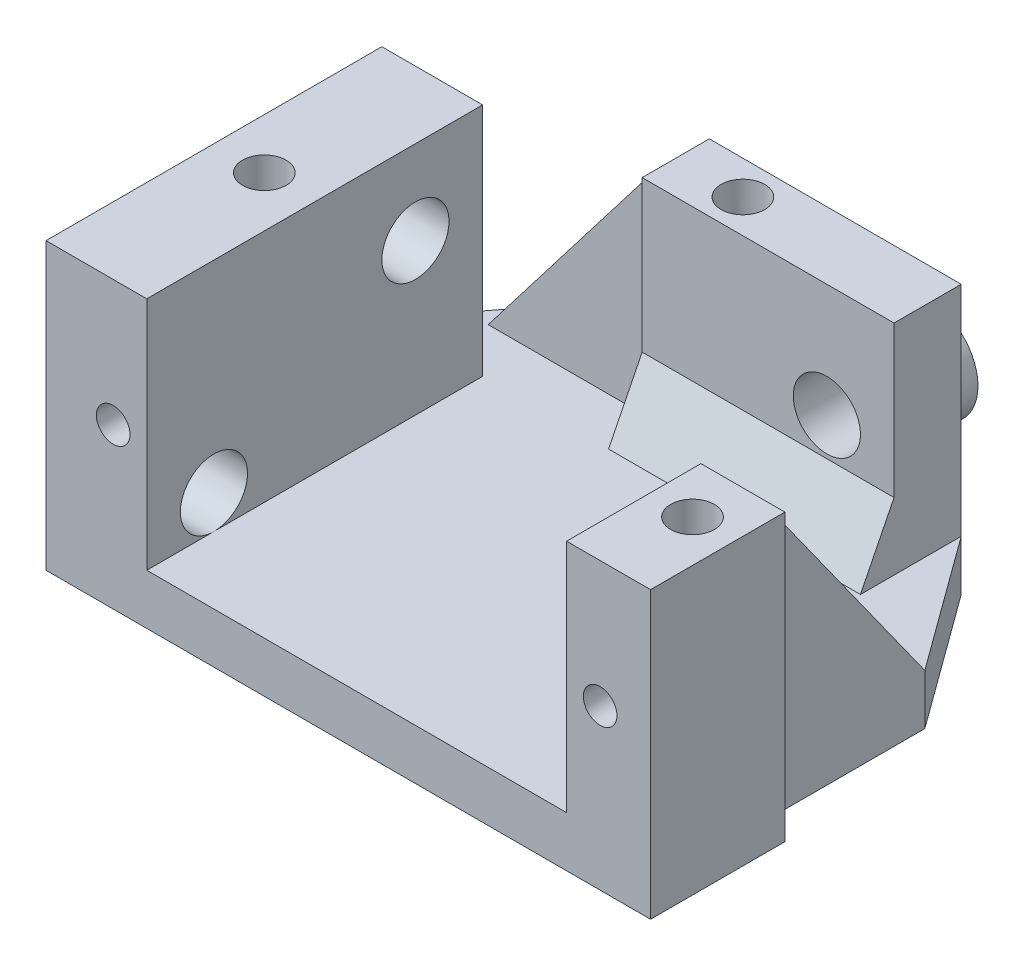
ISO-10303-21;
HEADER;
FILE_DESCRIPTION(('STEP AP214'),'2;1');
FILE_NAME('part.step','',(''),(''),'','','');
FILE_SCHEMA(('AUTOMOTIVE_DESIGN { 1 0 10303 214 1 1 1 1 }'));
ENDSEC;
DATA;
#1=APPLICATION_CONTEXT('core data for automotive mechanical design processes');
#2=APPLICATION_PROTOCOL_DEFINITION('international standard','automotive_design',2000,#1);
#3=PRODUCT_CONTEXT('',#1,'mechanical');
#4=PRODUCT('Part','Part','',(#3));
#5=PRODUCT_RELATED_PRODUCT_CATEGORY('part','',(#4));
#6=PRODUCT_DEFINITION_FORMATION('','',#4);
#7=PRODUCT_DEFINITION_CONTEXT('part definition',#1,'design');
#8=PRODUCT_DEFINITION('design','',#6,#7);
#9=PRODUCT_DEFINITION_SHAPE('','',#8);
#10=(LENGTH_UNIT() NAMED_UNIT(*) SI_UNIT(.MILLI.,.METRE.));
#11=(NAMED_UNIT(*) PLANE_ANGLE_UNIT() SI_UNIT($,.RADIAN.));
#12=(NAMED_UNIT(*) SI_UNIT($,.STERADIAN.) SOLID_ANGLE_UNIT());
#13=UNCERTAINTY_MEASURE_WITH_UNIT(LENGTH_MEASURE(1.E-05),#10,'distance_accuracy_value','');
#14=(GEOMETRIC_REPRESENTATION_CONTEXT(3) GLOBAL_UNCERTAINTY_ASSIGNED_CONTEXT((#13)) GLOBAL_UNIT_ASSIGNED_CONTEXT((#10,
#11,#12)) REPRESENTATION_CONTEXT('',''));
#15=CARTESIAN_POINT('',(0.,0.,0.));
#16=DIRECTION('',(0.,0.,1.));
#17=DIRECTION('',(1.,0.,0.));
#18=AXIS2_PLACEMENT_3D('',#15,#16,#17);
#19=CARTESIAN_POINT('',(0.,3.,0.));
#20=DIRECTION('',(0.,1.,0.));
#21=DIRECTION('',(0.,0.,1.));
#22=AXIS2_PLACEMENT_3D('',#19,#20,#21);
#23=PLANE('',#22);
#24=DIRECTION('',(0.61394061351492,0.,-0.789352217376327));
#25=VECTOR('',#24,1.);
#26=CARTESIAN_POINT('',(-7.50000000000001,3.,-16.5));
#27=LINE('',#26,#25);
#28=CARTESIAN_POINT('',(-11.,3.,-12.));
#29=VERTEX_POINT('',#28);
#30=CARTESIAN_POINT('',(-7.50000000000001,3.,-16.5));
#31=VERTEX_POINT('',#30);
#32=EDGE_CURVE('E185',#29,#31,#27,.T.);
#33=ORIENTED_EDGE('',*,*,#32,.F.);
#34=DIRECTION('',(-1.,0.,0.));
#35=VECTOR('',#34,1.);
#36=CARTESIAN_POINT('',(-5.,3.,-12.));
#37=LINE('',#36,#35);
#38=CARTESIAN_POINT('',(-5.,3.,-12.));
#39=VERTEX_POINT('',#38);
#40=EDGE_CURVE('E199',#39,#29,#37,.T.);
#41=ORIENTED_EDGE('',*,*,#40,.F.);
#42=DIRECTION('',(0.,0.,-1.));
#43=VECTOR('',#42,1.);
#44=CARTESIAN_POINT('',(-5.,3.,8.));
#45=LINE('',#44,#43);
#46=CARTESIAN_POINT('',(-5.,3.,4.));
#47=VERTEX_POINT('',#46);
#48=EDGE_CURVE('E356',#47,#39,#45,.T.);
#49=ORIENTED_EDGE('',*,*,#48,.F.);
#50=CARTESIAN_POINT('',(-5.,3.,8.));
#51=VERTEX_POINT('',#50);
#52=EDGE_CURVE('E213',#51,#47,#45,.T.);
#53=ORIENTED_EDGE('',*,*,#52,.F.);
#54=DIRECTION('',(-1.,0.,0.));
#55=VECTOR('',#54,1.);
#56=CARTESIAN_POINT('',(25.,3.,8.));
#57=LINE('',#56,#55);
#58=CARTESIAN_POINT('',(20.,3.,8.));
#59=VERTEX_POINT('',#58);
#60=EDGE_CURVE('E325',#59,#51,#57,.T.);
#61=ORIENTED_EDGE('',*,*,#60,.F.);
#62=DIRECTION('',(0.,0.,1.));
#63=VECTOR('',#62,1.);
#64=CARTESIAN_POINT('',(20.,3.,8.));
#65=LINE('',#64,#63);
#66=CARTESIAN_POINT('',(20.,3.,0.));
#67=VERTEX_POINT('',#66);
#68=EDGE_CURVE('E230',#67,#59,#65,.T.);
#69=ORIENTED_EDGE('',*,*,#68,.F.);
#70=DIRECTION('',(-1.,0.,0.));
#71=VECTOR('',#70,1.);
#72=CARTESIAN_POINT('',(25.,3.,0.));
#73=LINE('',#72,#71);
#74=CARTESIAN_POINT('',(21.6666666666667,3.,0.));
#75=VERTEX_POINT('',#74);
#76=EDGE_CURVE('E220',#75,#67,#73,.T.);
#77=ORIENTED_EDGE('',*,*,#76,.F.);
#78=DIRECTION('',(0.,0.,-1.));
#79=VECTOR('',#78,1.);
#80=CARTESIAN_POINT('',(21.6666666666667,3.,0.));
#81=LINE('',#80,#79);
#82=CARTESIAN_POINT('',(21.6666666666667,3.,-10.));
#83=VERTEX_POINT('',#82);
#84=EDGE_CURVE('E314',#75,#83,#81,.T.);
#85=ORIENTED_EDGE('',*,*,#84,.T.);
#86=DIRECTION('',(1.,0.,0.));
#87=VECTOR('',#86,1.);
#88=CARTESIAN_POINT('',(23.3333333333333,3.,-10.));
#89=LINE('',#88,#87);
#90=CARTESIAN_POINT('',(23.3333333333333,3.,-10.));
#91=VERTEX_POINT('',#90);
#92=EDGE_CURVE('E317',#83,#91,#89,.T.);
#93=ORIENTED_EDGE('',*,*,#92,.T.);
#94=DIRECTION('',(-0.589172157449442,0.,-0.808007530216378));
#95=VECTOR('',#94,1.);
#96=CARTESIAN_POINT('',(23.3333333333333,3.,-10.));
#97=LINE('',#96,#95);
#98=CARTESIAN_POINT('',(17.5,3.,-18.));
#99=VERTEX_POINT('',#98);
#100=EDGE_CURVE('E294',#91,#99,#97,.T.);
#101=ORIENTED_EDGE('',*,*,#100,.T.);
#102=DIRECTION('',(0.,0.,-1.));
#103=VECTOR('',#102,1.);
#104=CARTESIAN_POINT('',(17.5,3.,-14.));
#105=LINE('',#104,#103);
#106=CARTESIAN_POINT('',(17.5,3.,-12.));
#107=VERTEX_POINT('',#106);
#108=EDGE_CURVE('E49',#107,#99,#105,.T.);
#109=ORIENTED_EDGE('',*,*,#108,.F.);
#110=DIRECTION('',(-1.,0.,0.));
#111=VECTOR('',#110,1.);
#112=CARTESIAN_POINT('',(0.,3.,-12.));
#113=LINE('',#112,#111);
#114=CARTESIAN_POINT('',(2.5,3.,-12.));
#115=VERTEX_POINT('',#114);
#116=EDGE_CURVE('E268',#107,#115,#113,.T.);
#117=ORIENTED_EDGE('',*,*,#116,.T.);
#118=DIRECTION('',(0.,0.,1.));
#119=VECTOR('',#118,1.);
#120=CARTESIAN_POINT('',(2.5,3.,-14.));
#121=LINE('',#120,#119);
#122=CARTESIAN_POINT('',(2.5,3.,-14.8333333333333));
#123=VERTEX_POINT('',#122);
#124=EDGE_CURVE('E57',#123,#115,#121,.T.);
#125=ORIENTED_EDGE('',*,*,#124,.F.);
#126=DIRECTION('',(1.,0.,0.));
#127=VECTOR('',#126,1.);
#128=CARTESIAN_POINT('',(2.5,3.,-14.8333333333333));
#129=LINE('',#128,#127);
#130=CARTESIAN_POINT('',(-7.50000000000001,3.,-14.8333333333333));
#131=VERTEX_POINT('',#130);
#132=EDGE_CURVE('E399',#131,#123,#129,.T.);
#133=ORIENTED_EDGE('',*,*,#132,.F.);
#134=DIRECTION('',(0.,0.,1.));
#135=VECTOR('',#134,1.);
#136=CARTESIAN_POINT('',(-7.50000000000001,3.,-14.8333333333333));
#137=LINE('',#136,#135);
#138=EDGE_CURVE('E201',#31,#131,#137,.T.);
#139=ORIENTED_EDGE('',*,*,#138,.F.);
#140=EDGE_LOOP('',(#33,#41,#49,#53,#61,#69,#77,#85,#93,#101,#109,#117,#125,#133,#139));
#141=FACE_BOUND('',#140,.T.);
#142=ADVANCED_FACE('F33',(#141),#23,.T.);
#143=CARTESIAN_POINT('',(2.5,16.,-14.));
#144=DIRECTION('',(1.,0.,0.));
#145=DIRECTION('',(0.,0.,-1.));
#146=AXIS2_PLACEMENT_3D('',#143,#144,#145);
#147=PLANE('',#146);
#148=DIRECTION('',(0.,-1.,0.));
#149=VECTOR('',#148,1.);
#150=CARTESIAN_POINT('',(2.5,26.137937550497,-14.8333333333333));
#151=LINE('',#150,#149);
#152=CARTESIAN_POINT('',(2.5,16.,-14.8333333333333));
#153=VERTEX_POINT('',#152);
#154=EDGE_CURVE('E401',#153,#123,#151,.T.);
#155=ORIENTED_EDGE('',*,*,#154,.T.);
#156=ORIENTED_EDGE('',*,*,#124,.T.);
#157=DIRECTION('',(0.,0.894427190999915,-0.44721359549996));
#158=VECTOR('',#157,1.);
#159=CARTESIAN_POINT('',(2.5,14.2,-17.6));
#160=LINE('',#159,#158);
#161=CARTESIAN_POINT('',(2.5,6.99999999999997,-14.));
#162=VERTEX_POINT('',#161);
#163=EDGE_CURVE('E193',#115,#162,#160,.T.);
#164=ORIENTED_EDGE('',*,*,#163,.T.);
#165=DIRECTION('',(0.,-1.,0.));
#166=VECTOR('',#165,1.);
#167=CARTESIAN_POINT('',(2.5,16.,-14.));
#168=LINE('',#167,#166);
#169=CARTESIAN_POINT('',(2.5,16.,-14.));
#170=VERTEX_POINT('',#169);
#171=EDGE_CURVE('E353',#170,#162,#168,.T.);
#172=ORIENTED_EDGE('',*,*,#171,.F.);
#173=DIRECTION('',(0.,0.,1.));
#174=VECTOR('',#173,1.);
#175=CARTESIAN_POINT('',(2.5,16.,-14.));
#176=LINE('',#175,#174);
#177=EDGE_CURVE('E340',#153,#170,#176,.T.);
#178=ORIENTED_EDGE('',*,*,#177,.F.);
#179=EDGE_LOOP('',(#155,#156,#164,#172,#178));
#180=FACE_BOUND('',#179,.T.);
#181=ADVANCED_FACE('F457',(#180),#147,.F.);
#182=DIRECTION('',(0.,-1.,0.));
#183=VECTOR('',#182,1.);
#184=CARTESIAN_POINT('',(2.5,26.137937550497,-16.5));
#185=LINE('',#184,#183);
#186=CARTESIAN_POINT('',(2.5,16.,-16.5));
#187=VERTEX_POINT('',#186);
#188=CARTESIAN_POINT('',(2.5,0.,-16.5));
#189=VERTEX_POINT('',#188);
#190=EDGE_CURVE('E403',#187,#189,#185,.T.);
#191=ORIENTED_EDGE('',*,*,#190,.F.);
#192=CARTESIAN_POINT('',(2.5,16.,-18.));
#193=VERTEX_POINT('',#192);
#194=EDGE_CURVE('E336',#193,#187,#176,.T.);
#195=ORIENTED_EDGE('',*,*,#194,.F.);
#196=DIRECTION('',(0.,-1.,0.));
#197=VECTOR('',#196,1.);
#198=CARTESIAN_POINT('',(2.5,16.,-18.));
#199=LINE('',#198,#197);
#200=CARTESIAN_POINT('',(2.5,0.,-18.));
#201=VERTEX_POINT('',#200);
#202=EDGE_CURVE('E286',#193,#201,#199,.T.);
#203=ORIENTED_EDGE('',*,*,#202,.T.);
#204=DIRECTION('',(0.,0.,-1.));
#205=VECTOR('',#204,1.);
#206=CARTESIAN_POINT('',(2.5,0.,0.));
#207=LINE('',#206,#205);
#208=EDGE_CURVE('E42',#189,#201,#207,.T.);
#209=ORIENTED_EDGE('',*,*,#208,.F.);
#210=EDGE_LOOP('',(#191,#195,#203,#209));
#211=FACE_BOUND('',#210,.T.);
#212=ADVANCED_FACE('F462',(#211),#147,.F.);
#213=CARTESIAN_POINT('',(25.,3.,-18.));
#214=DIRECTION('',(-1.,0.,0.));
#215=DIRECTION('',(0.,0.,1.));
#216=AXIS2_PLACEMENT_3D('',#213,#214,#215);
#217=PLANE('',#216);
#218=DIRECTION('',(0.,0.,-1.));
#219=VECTOR('',#218,1.);
#220=CARTESIAN_POINT('',(25.,0.,-18.));
#221=LINE('',#220,#219);
#222=CARTESIAN_POINT('',(25.,0.,8.));
#223=VERTEX_POINT('',#222);
#224=CARTESIAN_POINT('',(25.,0.,0.));
#225=VERTEX_POINT('',#224);
#226=EDGE_CURVE('E251',#223,#225,#221,.T.);
#227=ORIENTED_EDGE('',*,*,#226,.T.);
#228=DIRECTION('',(0.,-1.,0.));
#229=VECTOR('',#228,1.);
#230=CARTESIAN_POINT('',(25.,17.,0.));
#231=LINE('',#230,#229);
#232=CARTESIAN_POINT('',(25.,17.,0.));
#233=VERTEX_POINT('',#232);
#234=EDGE_CURVE('E249',#233,#225,#231,.T.);
#235=ORIENTED_EDGE('',*,*,#234,.F.);
#236=DIRECTION('',(0.,0.,-1.));
#237=VECTOR('',#236,1.);
#238=CARTESIAN_POINT('',(25.,17.,8.));
#239=LINE('',#238,#237);
#240=CARTESIAN_POINT('',(25.,17.,8.));
#241=VERTEX_POINT('',#240);
#242=EDGE_CURVE('E226',#241,#233,#239,.T.);
#243=ORIENTED_EDGE('',*,*,#242,.F.);
#244=DIRECTION('',(0.,-1.,0.));
#245=VECTOR('',#244,1.);
#246=CARTESIAN_POINT('',(25.,17.,8.));
#247=LINE('',#246,#245);
#248=EDGE_CURVE('E238',#241,#223,#247,.T.);
#249=ORIENTED_EDGE('',*,*,#248,.T.);
#250=EDGE_LOOP('',(#227,#235,#243,#249));
#251=FACE_BOUND('',#250,.T.);
#252=ADVANCED_FACE('F434',(#251),#217,.F.);
#253=CARTESIAN_POINT('',(-25.,3.,-18.));
#254=DIRECTION('',(0.,0.,1.));
#255=DIRECTION('',(1.,0.,0.));
#256=AXIS2_PLACEMENT_3D('',#253,#254,#255);
#257=PLANE('',#256);
#258=CARTESIAN_POINT('',(13.5,9.25,-18.));
#259=DIRECTION('',(0.,0.,1.));
#260=DIRECTION('',(1.,0.,0.));
#261=AXIS2_PLACEMENT_3D('',#258,#259,#260);
#262=CIRCLE('',#261,3.);
#263=CARTESIAN_POINT('',(16.5,9.25,-18.));
#264=VERTEX_POINT('',#263);
#265=EDGE_CURVE('E257',#264,#264,#262,.F.);
#266=ORIENTED_EDGE('',*,*,#265,.F.);
#267=EDGE_LOOP('',(#266));
#268=FACE_BOUND('',#267,.T.);
#269=DIRECTION('',(-1.,0.,0.));
#270=VECTOR('',#269,1.);
#271=CARTESIAN_POINT('',(-25.,0.,-18.));
#272=LINE('',#271,#270);
#273=CARTESIAN_POINT('',(17.5,0.,-18.));
#274=VERTEX_POINT('',#273);
#275=EDGE_CURVE('E254',#274,#201,#272,.T.);
#276=ORIENTED_EDGE('',*,*,#275,.T.);
#277=ORIENTED_EDGE('',*,*,#202,.F.);
#278=DIRECTION('',(-1.,0.,0.));
#279=VECTOR('',#278,1.);
#280=CARTESIAN_POINT('',(2.5,16.,-18.));
#281=LINE('',#280,#279);
#282=CARTESIAN_POINT('',(17.5,16.,-18.));
#283=VERTEX_POINT('',#282);
#284=EDGE_CURVE('E344',#283,#193,#281,.T.);
#285=ORIENTED_EDGE('',*,*,#284,.F.);
#286=DIRECTION('',(0.,-1.,0.));
#287=VECTOR('',#286,1.);
#288=CARTESIAN_POINT('',(17.5,16.,-18.));
#289=LINE('',#288,#287);
#290=EDGE_CURVE('E291',#283,#99,#289,.T.);
#291=ORIENTED_EDGE('',*,*,#290,.T.);
#292=DIRECTION('',(0.,1.,0.));
#293=VECTOR('',#292,1.);
#294=CARTESIAN_POINT('',(17.5,-0.00100000000000013,-18.));
#295=LINE('',#294,#293);
#296=EDGE_CURVE('E289',#274,#99,#295,.T.);
#297=ORIENTED_EDGE('',*,*,#296,.F.);
#298=EDGE_LOOP('',(#276,#277,#285,#291,#297));
#299=FACE_BOUND('',#298,.T.);
#300=ADVANCED_FACE('F284',(#268,#299),#257,.F.);
#301=CARTESIAN_POINT('',(0.,0.,0.));
#302=DIRECTION('',(0.,1.,0.));
#303=DIRECTION('',(0.,0.,1.));
#304=AXIS2_PLACEMENT_3D('',#301,#302,#303);
#305=PLANE('',#304);
#306=DIRECTION('',(0.,0.,-1.));
#307=VECTOR('',#306,1.);
#308=CARTESIAN_POINT('',(-11.,0.,0.));
#309=LINE('',#308,#307);
#310=CARTESIAN_POINT('',(-11.,0.,8.));
#311=VERTEX_POINT('',#310);
#312=CARTESIAN_POINT('',(-11.,0.,-12.));
#313=VERTEX_POINT('',#312);
#314=EDGE_CURVE('E260',#311,#313,#309,.T.);
#315=ORIENTED_EDGE('',*,*,#314,.T.);
#316=DIRECTION('',(0.61394061351492,0.,-0.789352217376327));
#317=VECTOR('',#316,1.);
#318=CARTESIAN_POINT('',(-12.6692307692308,0.,-9.85384615384615));
#319=LINE('',#318,#317);
#320=CARTESIAN_POINT('',(-7.50000000000001,0.,-16.5));
#321=VERTEX_POINT('',#320);
#322=EDGE_CURVE('E188',#313,#321,#319,.T.);
#323=ORIENTED_EDGE('',*,*,#322,.T.);
#324=DIRECTION('',(1.,0.,0.));
#325=VECTOR('',#324,1.);
#326=CARTESIAN_POINT('',(0.,0.,-16.5));
#327=LINE('',#326,#325);
#328=EDGE_CURVE('E11',#321,#189,#327,.T.);
#329=ORIENTED_EDGE('',*,*,#328,.T.);
#330=ORIENTED_EDGE('',*,*,#208,.T.);
#331=ORIENTED_EDGE('',*,*,#275,.F.);
#332=DIRECTION('',(0.589172157449442,0.,0.808007530216378));
#333=VECTOR('',#332,1.);
#334=CARTESIAN_POINT('',(23.3333333333333,0.,-10.));
#335=LINE('',#334,#333);
#336=CARTESIAN_POINT('',(23.3333333333333,0.,-10.));
#337=VERTEX_POINT('',#336);
#338=EDGE_CURVE('E299',#274,#337,#335,.T.);
#339=ORIENTED_EDGE('',*,*,#338,.T.);
#340=DIRECTION('',(0.,0.,1.));
#341=VECTOR('',#340,1.);
#342=CARTESIAN_POINT('',(23.3333333333333,0.,0.));
#343=LINE('',#342,#341);
#344=CARTESIAN_POINT('',(23.3333333333333,0.,0.));
#345=VERTEX_POINT('',#344);
#346=EDGE_CURVE('E405',#337,#345,#343,.T.);
#347=ORIENTED_EDGE('',*,*,#346,.T.);
#348=DIRECTION('',(1.,0.,0.));
#349=VECTOR('',#348,1.);
#350=CARTESIAN_POINT('',(25.,0.,0.));
#351=LINE('',#350,#349);
#352=EDGE_CURVE('E297',#345,#225,#351,.T.);
#353=ORIENTED_EDGE('',*,*,#352,.T.);
#354=ORIENTED_EDGE('',*,*,#226,.F.);
#355=DIRECTION('',(-1.,0.,0.));
#356=VECTOR('',#355,1.);
#357=CARTESIAN_POINT('',(0.,0.,8.));
#358=LINE('',#357,#356);
#359=EDGE_CURVE('E262',#223,#311,#358,.T.);
#360=ORIENTED_EDGE('',*,*,#359,.T.);
#361=EDGE_LOOP('',(#315,#323,#329,#330,#331,#339,#347,#353,#354,#360));
#362=FACE_BOUND('',#361,.T.);
#363=ADVANCED_FACE('F277',(#362),#305,.F.);
#364=CARTESIAN_POINT('',(25.,17.,0.));
#365=DIRECTION('',(0.,0.,1.));
#366=DIRECTION('',(1.,0.,0.));
#367=AXIS2_PLACEMENT_3D('',#364,#365,#366);
#368=PLANE('',#367);
#369=ORIENTED_EDGE('',*,*,#234,.T.);
#370=ORIENTED_EDGE('',*,*,#352,.F.);
#371=DIRECTION('',(0.,1.,0.));
#372=VECTOR('',#371,1.);
#373=CARTESIAN_POINT('',(23.3333333333333,-7.13793755049704,0.));
#374=LINE('',#373,#372);
#375=CARTESIAN_POINT('',(23.3333333333333,17.,0.));
#376=VERTEX_POINT('',#375);
#377=EDGE_CURVE('E318',#345,#376,#374,.T.);
#378=ORIENTED_EDGE('',*,*,#377,.T.);
#379=DIRECTION('',(-1.,0.,0.));
#380=VECTOR('',#379,1.);
#381=CARTESIAN_POINT('',(25.,17.,0.));
#382=LINE('',#381,#380);
#383=EDGE_CURVE('E231',#233,#376,#382,.T.);
#384=ORIENTED_EDGE('',*,*,#383,.F.);
#385=EDGE_LOOP('',(#369,#370,#378,#384));
#386=FACE_BOUND('',#385,.T.);
#387=ADVANCED_FACE('F430',(#386),#368,.F.);
#388=CARTESIAN_POINT('',(21.6666666666667,17.,0.));
#389=VERTEX_POINT('',#388);
#390=CARTESIAN_POINT('',(20.,17.,0.));
#391=VERTEX_POINT('',#390);
#392=EDGE_CURVE('E229',#389,#391,#382,.T.);
#393=ORIENTED_EDGE('',*,*,#392,.F.);
#394=DIRECTION('',(0.,1.,0.));
#395=VECTOR('',#394,1.);
#396=CARTESIAN_POINT('',(21.6666666666667,-7.13793755049704,0.));
#397=LINE('',#396,#395);
#398=EDGE_CURVE('E312',#75,#389,#397,.T.);
#399=ORIENTED_EDGE('',*,*,#398,.F.);
#400=ORIENTED_EDGE('',*,*,#76,.T.);
#401=DIRECTION('',(0.,-1.,0.));
#402=VECTOR('',#401,1.);
#403=CARTESIAN_POINT('',(20.,17.,0.));
#404=LINE('',#403,#402);
#405=EDGE_CURVE('E246',#391,#67,#404,.T.);
#406=ORIENTED_EDGE('',*,*,#405,.F.);
#407=EDGE_LOOP('',(#393,#399,#400,#406));
#408=FACE_BOUND('',#407,.T.);
#409=ADVANCED_FACE('F421',(#408),#368,.F.);
#410=CARTESIAN_POINT('',(20.,17.,8.));
#411=DIRECTION('',(1.,0.,0.));
#412=DIRECTION('',(0.,0.,-1.));
#413=AXIS2_PLACEMENT_3D('',#410,#411,#412);
#414=PLANE('',#413);
#415=ORIENTED_EDGE('',*,*,#68,.T.);
#416=DIRECTION('',(0.,-1.,0.));
#417=VECTOR('',#416,1.);
#418=CARTESIAN_POINT('',(20.,17.,8.));
#419=LINE('',#418,#417);
#420=CARTESIAN_POINT('',(20.,17.,8.));
#421=VERTEX_POINT('',#420);
#422=EDGE_CURVE('E243',#421,#59,#419,.T.);
#423=ORIENTED_EDGE('',*,*,#422,.F.);
#424=DIRECTION('',(0.,0.,1.));
#425=VECTOR('',#424,1.);
#426=CARTESIAN_POINT('',(20.,17.,8.));
#427=LINE('',#426,#425);
#428=EDGE_CURVE('E234',#391,#421,#427,.T.);
#429=ORIENTED_EDGE('',*,*,#428,.F.);
#430=ORIENTED_EDGE('',*,*,#405,.T.);
#431=EDGE_LOOP('',(#415,#423,#429,#430));
#432=FACE_BOUND('',#431,.T.);
#433=ADVANCED_FACE('F799',(#432),#414,.F.);
#434=CARTESIAN_POINT('',(25.,17.,8.));
#435=DIRECTION('',(0.,0.,-1.));
#436=DIRECTION('',(-1.,0.,0.));
#437=AXIS2_PLACEMENT_3D('',#434,#435,#436);
#438=PLANE('',#437);
#439=CARTESIAN_POINT('',(-7.,9.5,8.));
#440=DIRECTION('',(0.,0.,1.));
#441=DIRECTION('',(1.,0.,0.));
#442=AXIS2_PLACEMENT_3D('',#439,#440,#441);
#443=CIRCLE('',#442,1.);
#444=CARTESIAN_POINT('',(-6.,9.5,8.));
#445=VERTEX_POINT('',#444);
#446=EDGE_CURVE('E570',#445,#445,#443,.T.);
#447=ORIENTED_EDGE('',*,*,#446,.F.);
#448=EDGE_LOOP('',(#447));
#449=FACE_BOUND('',#448,.T.);
#450=CARTESIAN_POINT('',(22.,9.5,8.));
#451=DIRECTION('',(0.,0.,1.));
#452=DIRECTION('',(1.,0.,0.));
#453=AXIS2_PLACEMENT_3D('',#450,#451,#452);
#454=CIRCLE('',#453,1.);
#455=CARTESIAN_POINT('',(23.,9.5,8.));
#456=VERTEX_POINT('',#455);
#457=EDGE_CURVE('E581',#456,#456,#454,.T.);
#458=ORIENTED_EDGE('',*,*,#457,.F.);
#459=EDGE_LOOP('',(#458));
#460=FACE_BOUND('',#459,.T.);
#461=ORIENTED_EDGE('',*,*,#422,.T.);
#462=ORIENTED_EDGE('',*,*,#60,.T.);
#463=DIRECTION('',(0.,-1.,0.));
#464=VECTOR('',#463,1.);
#465=CARTESIAN_POINT('',(-5.,17.,8.));
#466=LINE('',#465,#464);
#467=CARTESIAN_POINT('',(-5.,17.,8.));
#468=VERTEX_POINT('',#467);
#469=EDGE_CURVE('E222',#468,#51,#466,.T.);
#470=ORIENTED_EDGE('',*,*,#469,.F.);
#471=DIRECTION('',(1.,0.,0.));
#472=VECTOR('',#471,1.);
#473=CARTESIAN_POINT('',(-5.,17.,8.));
#474=LINE('',#473,#472);
#475=CARTESIAN_POINT('',(-11.,17.,8.));
#476=VERTEX_POINT('',#475);
#477=EDGE_CURVE('E362',#476,#468,#474,.T.);
#478=ORIENTED_EDGE('',*,*,#477,.F.);
#479=DIRECTION('',(0.,-1.,0.));
#480=VECTOR('',#479,1.);
#481=CARTESIAN_POINT('',(-11.,17.,8.));
#482=LINE('',#481,#480);
#483=EDGE_CURVE('E218',#476,#311,#482,.T.);
#484=ORIENTED_EDGE('',*,*,#483,.T.);
#485=ORIENTED_EDGE('',*,*,#359,.F.);
#486=ORIENTED_EDGE('',*,*,#248,.F.);
#487=DIRECTION('',(1.,0.,0.));
#488=VECTOR('',#487,1.);
#489=CARTESIAN_POINT('',(25.,17.,8.));
#490=LINE('',#489,#488);
#491=EDGE_CURVE('E236',#421,#241,#490,.T.);
#492=ORIENTED_EDGE('',*,*,#491,.F.);
#493=EDGE_LOOP('',(#461,#462,#470,#478,#484,#485,#486,#492));
#494=FACE_BOUND('',#493,.T.);
#495=ADVANCED_FACE('F438',(#449,#460,#494),#438,.F.);
#496=CARTESIAN_POINT('',(0.,17.,0.));
#497=DIRECTION('',(0.,1.,0.));
#498=DIRECTION('',(0.,0.,1.));
#499=AXIS2_PLACEMENT_3D('',#496,#497,#498);
#500=PLANE('',#499);
#501=CARTESIAN_POINT('',(22.5,17.,3.));
#502=DIRECTION('',(0.,1.,0.));
#503=DIRECTION('',(0.,0.,1.));
#504=AXIS2_PLACEMENT_3D('',#501,#502,#503);
#505=CIRCLE('',#504,1.3);
#506=CARTESIAN_POINT('',(22.5,17.,4.3));
#507=VERTEX_POINT('',#506);
#508=EDGE_CURVE('E569',#507,#507,#505,.T.);
#509=ORIENTED_EDGE('',*,*,#508,.F.);
#510=EDGE_LOOP('',(#509));
#511=FACE_BOUND('',#510,.T.);
#512=DIRECTION('',(1.,0.,0.));
#513=VECTOR('',#512,1.);
#514=CARTESIAN_POINT('',(-11.001,17.,0.));
#515=LINE('',#514,#513);
#516=EDGE_CURVE('E308',#389,#376,#515,.T.);
#517=ORIENTED_EDGE('',*,*,#516,.F.);
#518=ORIENTED_EDGE('',*,*,#392,.T.);
#519=ORIENTED_EDGE('',*,*,#428,.T.);
#520=ORIENTED_EDGE('',*,*,#491,.T.);
#521=ORIENTED_EDGE('',*,*,#242,.T.);
#522=ORIENTED_EDGE('',*,*,#383,.T.);
#523=EDGE_LOOP('',(#517,#518,#519,#520,#521,#522));
#524=FACE_BOUND('',#523,.T.);
#525=ADVANCED_FACE('F425',(#511,#524),#500,.T.);
#526=CARTESIAN_POINT('',(-5.,17.,8.));
#527=DIRECTION('',(-1.,0.,0.));
#528=DIRECTION('',(0.,0.,1.));
#529=AXIS2_PLACEMENT_3D('',#526,#527,#528);
#530=PLANE('',#529);
#531=CARTESIAN_POINT('',(-5.,12.,-8.));
#532=DIRECTION('',(-1.,0.,0.));
#533=DIRECTION('',(0.,0.,1.));
#534=AXIS2_PLACEMENT_3D('',#531,#532,#533);
#535=CIRCLE('',#534,2.);
#536=CARTESIAN_POINT('',(-5.,12.,-6.));
#537=VERTEX_POINT('',#536);
#538=EDGE_CURVE('E384',#537,#537,#535,.T.);
#539=ORIENTED_EDGE('',*,*,#538,.T.);
#540=EDGE_LOOP('',(#539));
#541=FACE_BOUND('',#540,.T.);
#542=ORIENTED_EDGE('',*,*,#52,.T.);
#543=CARTESIAN_POINT('',(-5.,5.,4.));
#544=DIRECTION('',(-1.,0.,0.));
#545=DIRECTION('',(0.,0.,1.));
#546=AXIS2_PLACEMENT_3D('',#543,#544,#545);
#547=CIRCLE('',#546,2.);
#548=EDGE_CURVE('E375',#47,#47,#547,.T.);
#549=ORIENTED_EDGE('',*,*,#548,.T.);
#550=ORIENTED_EDGE('',*,*,#48,.T.);
#551=DIRECTION('',(0.,-1.,0.));
#552=VECTOR('',#551,1.);
#553=CARTESIAN_POINT('',(-5.,17.,-12.));
#554=LINE('',#553,#552);
#555=CARTESIAN_POINT('',(-5.,17.,-12.));
#556=VERTEX_POINT('',#555);
#557=EDGE_CURVE('E211',#556,#39,#554,.T.);
#558=ORIENTED_EDGE('',*,*,#557,.F.);
#559=DIRECTION('',(0.,0.,-1.));
#560=VECTOR('',#559,1.);
#561=CARTESIAN_POINT('',(-5.,17.,8.));
#562=LINE('',#561,#560);
#563=EDGE_CURVE('E212',#468,#556,#562,.T.);
#564=ORIENTED_EDGE('',*,*,#563,.F.);
#565=ORIENTED_EDGE('',*,*,#469,.T.);
#566=EDGE_LOOP('',(#542,#549,#550,#558,#564,#565));
#567=FACE_BOUND('',#566,.T.);
#568=ADVANCED_FACE('F370',(#541,#567),#530,.F.);
#569=CARTESIAN_POINT('',(-5.,17.,-12.));
#570=DIRECTION('',(0.,0.,1.));
#571=DIRECTION('',(1.,0.,0.));
#572=AXIS2_PLACEMENT_3D('',#569,#570,#571);
#573=PLANE('',#572);
#574=ORIENTED_EDGE('',*,*,#40,.T.);
#575=DIRECTION('',(0.,-1.,0.));
#576=VECTOR('',#575,1.);
#577=CARTESIAN_POINT('',(-11.,17.,-12.));
#578=LINE('',#577,#576);
#579=CARTESIAN_POINT('',(-11.,17.,-12.));
#580=VERTEX_POINT('',#579);
#581=EDGE_CURVE('E208',#580,#29,#578,.T.);
#582=ORIENTED_EDGE('',*,*,#581,.F.);
#583=DIRECTION('',(-1.,0.,0.));
#584=VECTOR('',#583,1.);
#585=CARTESIAN_POINT('',(-5.,17.,-12.));
#586=LINE('',#585,#584);
#587=EDGE_CURVE('E359',#556,#580,#586,.T.);
#588=ORIENTED_EDGE('',*,*,#587,.F.);
#589=ORIENTED_EDGE('',*,*,#557,.T.);
#590=EDGE_LOOP('',(#574,#582,#588,#589));
#591=FACE_BOUND('',#590,.T.);
#592=ADVANCED_FACE('F207',(#591),#573,.F.);
#593=CARTESIAN_POINT('',(-11.,17.,8.));
#594=DIRECTION('',(1.,0.,0.));
#595=DIRECTION('',(0.,0.,-1.));
#596=AXIS2_PLACEMENT_3D('',#593,#594,#595);
#597=PLANE('',#596);
#598=CARTESIAN_POINT('',(-11.,5.,4.));
#599=DIRECTION('',(-1.,0.,0.));
#600=DIRECTION('',(0.,0.,1.));
#601=AXIS2_PLACEMENT_3D('',#598,#599,#600);
#602=CIRCLE('',#601,2.);
#603=CARTESIAN_POINT('',(-11.,5.,6.));
#604=VERTEX_POINT('',#603);
#605=EDGE_CURVE('E378',#604,#604,#602,.T.);
#606=ORIENTED_EDGE('',*,*,#605,.F.);
#607=EDGE_LOOP('',(#606));
#608=FACE_BOUND('',#607,.T.);
#609=CARTESIAN_POINT('',(-11.,12.,-8.));
#610=DIRECTION('',(-1.,0.,0.));
#611=DIRECTION('',(0.,0.,1.));
#612=AXIS2_PLACEMENT_3D('',#609,#610,#611);
#613=CIRCLE('',#612,2.);
#614=CARTESIAN_POINT('',(-11.,12.,-6.));
#615=VERTEX_POINT('',#614);
#616=EDGE_CURVE('E391',#615,#615,#613,.T.);
#617=ORIENTED_EDGE('',*,*,#616,.F.);
#618=EDGE_LOOP('',(#617));
#619=FACE_BOUND('',#618,.T.);
#620=ORIENTED_EDGE('',*,*,#581,.T.);
#621=DIRECTION('',(0.,-1.,0.));
#622=VECTOR('',#621,1.);
#623=CARTESIAN_POINT('',(-11.,17.,-12.));
#624=LINE('',#623,#622);
#625=EDGE_CURVE('E181',#29,#313,#624,.T.);
#626=ORIENTED_EDGE('',*,*,#625,.T.);
#627=ORIENTED_EDGE('',*,*,#314,.F.);
#628=ORIENTED_EDGE('',*,*,#483,.F.);
#629=DIRECTION('',(0.,0.,1.));
#630=VECTOR('',#629,1.);
#631=CARTESIAN_POINT('',(-11.,17.,8.));
#632=LINE('',#631,#630);
#633=EDGE_CURVE('E217',#580,#476,#632,.T.);
#634=ORIENTED_EDGE('',*,*,#633,.F.);
#635=EDGE_LOOP('',(#620,#626,#627,#628,#634));
#636=FACE_BOUND('',#635,.T.);
#637=ADVANCED_FACE('F215',(#608,#619,#636),#597,.F.);
#638=CARTESIAN_POINT('',(0.,17.,0.));
#639=DIRECTION('',(0.,1.,0.));
#640=DIRECTION('',(0.,0.,1.));
#641=AXIS2_PLACEMENT_3D('',#638,#639,#640);
#642=PLANE('',#641);
#643=CARTESIAN_POINT('',(-8.,17.,-2.));
#644=DIRECTION('',(0.,1.,0.));
#645=DIRECTION('',(0.,0.,1.));
#646=AXIS2_PLACEMENT_3D('',#643,#644,#645);
#647=CIRCLE('',#646,1.3);
#648=CARTESIAN_POINT('',(-8.,17.,-0.699999999999999));
#649=VERTEX_POINT('',#648);
#650=EDGE_CURVE('E590',#649,#649,#647,.T.);
#651=ORIENTED_EDGE('',*,*,#650,.F.);
#652=EDGE_LOOP('',(#651));
#653=FACE_BOUND('',#652,.T.);
#654=ORIENTED_EDGE('',*,*,#563,.T.);
#655=ORIENTED_EDGE('',*,*,#587,.T.);
#656=ORIENTED_EDGE('',*,*,#633,.T.);
#657=ORIENTED_EDGE('',*,*,#477,.T.);
#658=EDGE_LOOP('',(#654,#655,#656,#657));
#659=FACE_BOUND('',#658,.T.);
#660=ADVANCED_FACE('F440',(#653,#659),#642,.T.);
#661=CARTESIAN_POINT('',(2.5,16.,-14.));
#662=DIRECTION('',(0.,0.,-1.));
#663=DIRECTION('',(-1.,0.,0.));
#664=AXIS2_PLACEMENT_3D('',#661,#662,#663);
#665=PLANE('',#664);
#666=CARTESIAN_POINT('',(13.5,9.25,-14.));
#667=DIRECTION('',(0.,0.,-1.));
#668=DIRECTION('',(-1.,0.,0.));
#669=AXIS2_PLACEMENT_3D('',#666,#667,#668);
#670=CIRCLE('',#669,2.);
#671=CARTESIAN_POINT('',(11.5,9.25,-14.));
#672=VERTEX_POINT('',#671);
#673=EDGE_CURVE('E330',#672,#672,#670,.T.);
#674=ORIENTED_EDGE('',*,*,#673,.T.);
#675=EDGE_LOOP('',(#674));
#676=FACE_BOUND('',#675,.T.);
#677=ORIENTED_EDGE('',*,*,#171,.T.);
#678=DIRECTION('',(1.,0.,0.));
#679=VECTOR('',#678,1.);
#680=CARTESIAN_POINT('',(2.5,6.99999999999997,-14.));
#681=LINE('',#680,#679);
#682=CARTESIAN_POINT('',(17.5,6.99999999999997,-14.));
#683=VERTEX_POINT('',#682);
#684=EDGE_CURVE('E265',#162,#683,#681,.T.);
#685=ORIENTED_EDGE('',*,*,#684,.T.);
#686=DIRECTION('',(0.,-1.,0.));
#687=VECTOR('',#686,1.);
#688=CARTESIAN_POINT('',(17.5,16.,-14.));
#689=LINE('',#688,#687);
#690=CARTESIAN_POINT('',(17.5,16.,-14.));
#691=VERTEX_POINT('',#690);
#692=EDGE_CURVE('E350',#691,#683,#689,.T.);
#693=ORIENTED_EDGE('',*,*,#692,.F.);
#694=DIRECTION('',(1.,0.,0.));
#695=VECTOR('',#694,1.);
#696=CARTESIAN_POINT('',(2.5,16.,-14.));
#697=LINE('',#696,#695);
#698=EDGE_CURVE('E339',#170,#691,#697,.T.);
#699=ORIENTED_EDGE('',*,*,#698,.F.);
#700=EDGE_LOOP('',(#677,#685,#693,#699));
#701=FACE_BOUND('',#700,.T.);
#702=ADVANCED_FACE('F442',(#676,#701),#665,.F.);
#703=CARTESIAN_POINT('',(17.5,16.,-14.));
#704=DIRECTION('',(-1.,0.,0.));
#705=DIRECTION('',(0.,0.,1.));
#706=AXIS2_PLACEMENT_3D('',#703,#704,#705);
#707=PLANE('',#706);
#708=ORIENTED_EDGE('',*,*,#108,.T.);
#709=ORIENTED_EDGE('',*,*,#290,.F.);
#710=DIRECTION('',(0.,0.,-1.));
#711=VECTOR('',#710,1.);
#712=CARTESIAN_POINT('',(17.5,16.,-14.));
#713=LINE('',#712,#711);
#714=EDGE_CURVE('E342',#691,#283,#713,.T.);
#715=ORIENTED_EDGE('',*,*,#714,.F.);
#716=ORIENTED_EDGE('',*,*,#692,.T.);
#717=DIRECTION('',(0.,-0.894427190999915,0.44721359549996));
#718=VECTOR('',#717,1.);
#719=CARTESIAN_POINT('',(17.5,14.2,-17.6));
#720=LINE('',#719,#718);
#721=EDGE_CURVE('E270',#683,#107,#720,.T.);
#722=ORIENTED_EDGE('',*,*,#721,.T.);
#723=EDGE_LOOP('',(#708,#709,#715,#716,#722));
#724=FACE_BOUND('',#723,.T.);
#725=ADVANCED_FACE('F449',(#724),#707,.F.);
#726=CARTESIAN_POINT('',(0.,16.,0.));
#727=DIRECTION('',(0.,-1.,0.));
#728=DIRECTION('',(0.,0.,-1.));
#729=AXIS2_PLACEMENT_3D('',#726,#727,#728);
#730=PLANE('',#729);
#731=CARTESIAN_POINT('',(6.5,16.,-16.));
#732=DIRECTION('',(0.,-1.,0.));
#733=DIRECTION('',(0.,0.,-1.));
#734=AXIS2_PLACEMENT_3D('',#731,#732,#733);
#735=CIRCLE('',#734,1.3);
#736=CARTESIAN_POINT('',(6.5,16.,-17.3));
#737=VERTEX_POINT('',#736);
#738=EDGE_CURVE('E37',#737,#737,#735,.T.);
#739=ORIENTED_EDGE('',*,*,#738,.T.);
#740=EDGE_LOOP('',(#739));
#741=FACE_BOUND('',#740,.T.);
#742=ORIENTED_EDGE('',*,*,#194,.T.);
#743=DIRECTION('',(0.,0.,-1.));
#744=VECTOR('',#743,1.);
#745=CARTESIAN_POINT('',(2.5,16.,-14.5));
#746=LINE('',#745,#744);
#747=EDGE_CURVE('E381',#153,#187,#746,.T.);
#748=ORIENTED_EDGE('',*,*,#747,.F.);
#749=ORIENTED_EDGE('',*,*,#177,.T.);
#750=ORIENTED_EDGE('',*,*,#698,.T.);
#751=ORIENTED_EDGE('',*,*,#714,.T.);
#752=ORIENTED_EDGE('',*,*,#284,.T.);
#753=EDGE_LOOP('',(#742,#748,#749,#750,#751,#752));
#754=FACE_BOUND('',#753,.T.);
#755=ADVANCED_FACE('F479',(#741,#754),#730,.F.);
#756=CARTESIAN_POINT('',(13.5,9.25,-20.));
#757=DIRECTION('',(0.,0.,1.));
#758=DIRECTION('',(1.,0.,0.));
#759=AXIS2_PLACEMENT_3D('',#756,#757,#758);
#760=CYLINDRICAL_SURFACE('',#759,3.);
#761=CARTESIAN_POINT('',(13.5,9.25,-20.));
#762=DIRECTION('',(0.,0.,-1.));
#763=DIRECTION('',(-1.,0.,0.));
#764=AXIS2_PLACEMENT_3D('',#761,#762,#763);
#765=CIRCLE('',#764,3.);
#766=CARTESIAN_POINT('',(10.5,9.25,-20.));
#767=VERTEX_POINT('',#766);
#768=EDGE_CURVE('E333',#767,#767,#765,.T.);
#769=ORIENTED_EDGE('',*,*,#768,.F.);
#770=EDGE_LOOP('',(#769));
#771=FACE_BOUND('',#770,.T.);
#772=ORIENTED_EDGE('',*,*,#265,.T.);
#773=EDGE_LOOP('',(#772));
#774=FACE_BOUND('',#773,.T.);
#775=ADVANCED_FACE('F483',(#771,#774),#760,.T.);
#776=CARTESIAN_POINT('',(13.5,9.25,-20.));
#777=DIRECTION('',(0.,0.,-1.));
#778=DIRECTION('',(-1.,0.,0.));
#779=AXIS2_PLACEMENT_3D('',#776,#777,#778);
#780=PLANE('',#779);
#781=CARTESIAN_POINT('',(13.5,9.25,-20.));
#782=DIRECTION('',(0.,0.,-1.));
#783=DIRECTION('',(-1.,0.,0.));
#784=AXIS2_PLACEMENT_3D('',#781,#782,#783);
#785=CIRCLE('',#784,2.);
#786=CARTESIAN_POINT('',(11.5,9.25,-20.));
#787=VERTEX_POINT('',#786);
#788=EDGE_CURVE('E327',#787,#787,#785,.T.);
#789=ORIENTED_EDGE('',*,*,#788,.F.);
#790=EDGE_LOOP('',(#789));
#791=FACE_BOUND('',#790,.T.);
#792=ORIENTED_EDGE('',*,*,#768,.T.);
#793=EDGE_LOOP('',(#792));
#794=FACE_BOUND('',#793,.T.);
#795=ADVANCED_FACE('F487',(#791,#794),#780,.T.);
#796=CARTESIAN_POINT('',(13.5,9.25,-8.));
#797=DIRECTION('',(0.,0.,-1.));
#798=DIRECTION('',(-1.,0.,0.));
#799=AXIS2_PLACEMENT_3D('',#796,#797,#798);
#800=CYLINDRICAL_SURFACE('',#799,2.);
#801=ORIENTED_EDGE('',*,*,#788,.T.);
#802=EDGE_LOOP('',(#801));
#803=FACE_BOUND('',#802,.T.);
#804=ORIENTED_EDGE('',*,*,#673,.F.);
#805=EDGE_LOOP('',(#804));
#806=FACE_BOUND('',#805,.T.);
#807=ADVANCED_FACE('F491',(#803,#806),#800,.F.);
#808=CARTESIAN_POINT('',(23.3333333333333,-7.13793755049704,0.));
#809=DIRECTION('',(1.,0.,0.));
#810=DIRECTION('',(0.,0.,-1.));
#811=AXIS2_PLACEMENT_3D('',#808,#809,#810);
#812=PLANE('',#811);
#813=DIRECTION('',(0.,-0.813733471206735,-0.581238193719096));
#814=VECTOR('',#813,1.);
#815=CARTESIAN_POINT('',(23.3333333333333,3.,-10.));
#816=LINE('',#815,#814);
#817=EDGE_CURVE('E305',#376,#91,#816,.T.);
#818=ORIENTED_EDGE('',*,*,#817,.F.);
#819=ORIENTED_EDGE('',*,*,#377,.F.);
#820=ORIENTED_EDGE('',*,*,#346,.F.);
#821=DIRECTION('',(0.,1.,0.));
#822=VECTOR('',#821,1.);
#823=CARTESIAN_POINT('',(23.3333333333333,-0.00100000000000013,-10.));
#824=LINE('',#823,#822);
#825=EDGE_CURVE('E293',#337,#91,#824,.T.);
#826=ORIENTED_EDGE('',*,*,#825,.T.);
#827=EDGE_LOOP('',(#818,#819,#820,#826));
#828=FACE_BOUND('',#827,.T.);
#829=ADVANCED_FACE('F411',(#828),#812,.T.);
#830=CARTESIAN_POINT('',(21.6666666666667,-7.13793755049704,0.));
#831=DIRECTION('',(-1.,0.,0.));
#832=DIRECTION('',(0.,0.,1.));
#833=AXIS2_PLACEMENT_3D('',#830,#831,#832);
#834=PLANE('',#833);
#835=DIRECTION('',(0.,-0.813733471206735,-0.581238193719096));
#836=VECTOR('',#835,1.);
#837=CARTESIAN_POINT('',(21.6666666666667,3.,-10.));
#838=LINE('',#837,#836);
#839=EDGE_CURVE('E309',#389,#83,#838,.T.);
#840=ORIENTED_EDGE('',*,*,#839,.T.);
#841=ORIENTED_EDGE('',*,*,#84,.F.);
#842=ORIENTED_EDGE('',*,*,#398,.T.);
#843=EDGE_LOOP('',(#840,#841,#842));
#844=FACE_BOUND('',#843,.T.);
#845=ADVANCED_FACE('F418',(#844),#834,.T.);
#846=CARTESIAN_POINT('',(-11.001,3.,-10.));
#847=DIRECTION('',(0.,-0.581238193719096,0.813733471206735));
#848=DIRECTION('',(0.,-0.813733471206735,-0.581238193719096));
#849=AXIS2_PLACEMENT_3D('',#846,#847,#848);
#850=PLANE('',#849);
#851=ORIENTED_EDGE('',*,*,#516,.T.);
#852=ORIENTED_EDGE('',*,*,#817,.T.);
#853=ORIENTED_EDGE('',*,*,#92,.F.);
#854=ORIENTED_EDGE('',*,*,#839,.F.);
#855=EDGE_LOOP('',(#851,#852,#853,#854));
#856=FACE_BOUND('',#855,.T.);
#857=ADVANCED_FACE('F413',(#856),#850,.F.);
#858=CARTESIAN_POINT('',(23.3333333333333,-0.00100000000000013,-10.));
#859=DIRECTION('',(0.808007530216378,0.,-0.589172157449442));
#860=DIRECTION('',(-0.589172157449442,0.,-0.808007530216378));
#861=AXIS2_PLACEMENT_3D('',#858,#859,#860);
#862=PLANE('',#861);
#863=ORIENTED_EDGE('',*,*,#296,.T.);
#864=ORIENTED_EDGE('',*,*,#100,.F.);
#865=ORIENTED_EDGE('',*,*,#825,.F.);
#866=ORIENTED_EDGE('',*,*,#338,.F.);
#867=EDGE_LOOP('',(#863,#864,#865,#866));
#868=FACE_BOUND('',#867,.T.);
#869=ADVANCED_FACE('F408',(#868),#862,.T.);
#870=CARTESIAN_POINT('',(2.5,26.137937550497,-14.8333333333333));
#871=DIRECTION('',(0.,0.,-1.));
#872=DIRECTION('',(-1.,0.,0.));
#873=AXIS2_PLACEMENT_3D('',#870,#871,#872);
#874=PLANE('',#873);
#875=ORIENTED_EDGE('',*,*,#154,.F.);
#876=DIRECTION('',(-0.609710760849692,-0.7926239891046,0.));
#877=VECTOR('',#876,1.);
#878=CARTESIAN_POINT('',(7.39937502440377,22.3691875317249,-14.8333333333333));
#879=LINE('',#878,#877);
#880=EDGE_CURVE('E395',#153,#131,#879,.T.);
#881=ORIENTED_EDGE('',*,*,#880,.T.);
#882=ORIENTED_EDGE('',*,*,#132,.T.);
#883=EDGE_LOOP('',(#875,#881,#882));
#884=FACE_BOUND('',#883,.T.);
#885=ADVANCED_FACE('F504',(#884),#874,.F.);
#886=CARTESIAN_POINT('',(2.5,26.137937550497,-16.5));
#887=DIRECTION('',(0.,0.,1.));
#888=DIRECTION('',(1.,0.,0.));
#889=AXIS2_PLACEMENT_3D('',#886,#887,#888);
#890=PLANE('',#889);
#891=ORIENTED_EDGE('',*,*,#190,.T.);
#892=ORIENTED_EDGE('',*,*,#328,.F.);
#893=DIRECTION('',(0.,1.,0.));
#894=VECTOR('',#893,1.);
#895=CARTESIAN_POINT('',(-7.50000000000001,-2.,-16.5));
#896=LINE('',#895,#894);
#897=EDGE_CURVE('E202',#321,#31,#896,.T.);
#898=ORIENTED_EDGE('',*,*,#897,.T.);
#899=DIRECTION('',(-0.609710760849692,-0.7926239891046,0.));
#900=VECTOR('',#899,1.);
#901=CARTESIAN_POINT('',(-7.50000000000001,3.,-16.5));
#902=LINE('',#901,#900);
#903=EDGE_CURVE('E377',#187,#31,#902,.T.);
#904=ORIENTED_EDGE('',*,*,#903,.F.);
#905=EDGE_LOOP('',(#891,#892,#898,#904));
#906=FACE_BOUND('',#905,.T.);
#907=ADVANCED_FACE('F505',(#906),#890,.F.);
#908=CARTESIAN_POINT('',(-7.50000000000001,3.,-14.5));
#909=DIRECTION('',(0.7926239891046,-0.609710760849692,0.));
#910=DIRECTION('',(0.609710760849692,0.7926239891046,0.));
#911=AXIS2_PLACEMENT_3D('',#908,#909,#910);
#912=PLANE('',#911);
#913=ORIENTED_EDGE('',*,*,#747,.T.);
#914=ORIENTED_EDGE('',*,*,#903,.T.);
#915=ORIENTED_EDGE('',*,*,#138,.T.);
#916=ORIENTED_EDGE('',*,*,#880,.F.);
#917=EDGE_LOOP('',(#913,#914,#915,#916));
#918=FACE_BOUND('',#917,.T.);
#919=ADVANCED_FACE('F508',(#918),#912,.F.);
#920=CARTESIAN_POINT('',(-5.,12.,-8.));
#921=DIRECTION('',(-1.,0.,0.));
#922=DIRECTION('',(0.,0.,1.));
#923=AXIS2_PLACEMENT_3D('',#920,#921,#922);
#924=CYLINDRICAL_SURFACE('',#923,2.);
#925=ORIENTED_EDGE('',*,*,#538,.F.);
#926=EDGE_LOOP('',(#925));
#927=FACE_BOUND('',#926,.T.);
#928=ORIENTED_EDGE('',*,*,#616,.T.);
#929=EDGE_LOOP('',(#928));
#930=FACE_BOUND('',#929,.T.);
#931=ADVANCED_FACE('F515',(#927,#930),#924,.F.);
#932=CARTESIAN_POINT('',(-5.,5.,4.));
#933=DIRECTION('',(-1.,0.,0.));
#934=DIRECTION('',(0.,0.,1.));
#935=AXIS2_PLACEMENT_3D('',#932,#933,#934);
#936=CYLINDRICAL_SURFACE('',#935,2.);
#937=ORIENTED_EDGE('',*,*,#548,.F.);
#938=EDGE_LOOP('',(#937));
#939=FACE_BOUND('',#938,.T.);
#940=ORIENTED_EDGE('',*,*,#605,.T.);
#941=EDGE_LOOP('',(#940));
#942=FACE_BOUND('',#941,.T.);
#943=ADVANCED_FACE('F519',(#939,#942),#936,.F.);
#944=CARTESIAN_POINT('',(2.5,6.99999999999997,-14.));
#945=DIRECTION('',(0.,-0.44721359549996,-0.894427190999915));
#946=DIRECTION('',(1.,0.,0.));
#947=AXIS2_PLACEMENT_3D('',#944,#945,#946);
#948=PLANE('',#947);
#949=ORIENTED_EDGE('',*,*,#163,.F.);
#950=ORIENTED_EDGE('',*,*,#116,.F.);
#951=ORIENTED_EDGE('',*,*,#721,.F.);
#952=ORIENTED_EDGE('',*,*,#684,.F.);
#953=EDGE_LOOP('',(#949,#950,#951,#952));
#954=FACE_BOUND('',#953,.T.);
#955=ADVANCED_FACE('F35',(#954),#948,.F.);
#956=CARTESIAN_POINT('',(-7.50000000000001,-2.,-16.5));
#957=DIRECTION('',(0.789352217376327,0.,0.61394061351492));
#958=DIRECTION('',(0.61394061351492,0.,-0.789352217376327));
#959=AXIS2_PLACEMENT_3D('',#956,#957,#958);
#960=PLANE('',#959);
#961=ORIENTED_EDGE('',*,*,#625,.F.);
#962=ORIENTED_EDGE('',*,*,#32,.T.);
#963=ORIENTED_EDGE('',*,*,#897,.F.);
#964=ORIENTED_EDGE('',*,*,#322,.F.);
#965=EDGE_LOOP('',(#961,#962,#963,#964));
#966=FACE_BOUND('',#965,.T.);
#967=ADVANCED_FACE('F183',(#966),#960,.F.);
#968=CARTESIAN_POINT('',(6.5,11.,-16.));
#969=DIRECTION('',(0.,1.,0.));
#970=DIRECTION('',(0.,0.,1.));
#971=AXIS2_PLACEMENT_3D('',#968,#969,#970);
#972=CYLINDRICAL_SURFACE('',#971,1.3);
#973=CARTESIAN_POINT('',(6.5,11.,-16.));
#974=DIRECTION('',(0.,1.,0.));
#975=DIRECTION('',(0.,0.,1.));
#976=AXIS2_PLACEMENT_3D('',#973,#974,#975);
#977=CIRCLE('',#976,1.3);
#978=CARTESIAN_POINT('',(6.5,11.,-14.7));
#979=VERTEX_POINT('',#978);
#980=EDGE_CURVE('E584',#979,#979,#977,.T.);
#981=ORIENTED_EDGE('',*,*,#980,.F.);
#982=EDGE_LOOP('',(#981));
#983=FACE_BOUND('',#982,.T.);
#984=ORIENTED_EDGE('',*,*,#738,.F.);
#985=EDGE_LOOP('',(#984));
#986=FACE_BOUND('',#985,.T.);
#987=ADVANCED_FACE('F525',(#983,#986),#972,.F.);
#988=CARTESIAN_POINT('',(6.5,11.,-16.));
#989=DIRECTION('',(0.,1.,0.));
#990=DIRECTION('',(0.,0.,1.));
#991=AXIS2_PLACEMENT_3D('',#988,#989,#990);
#992=PLANE('',#991);
#993=ORIENTED_EDGE('',*,*,#980,.T.);
#994=EDGE_LOOP('',(#993));
#995=FACE_BOUND('',#994,.T.);
#996=ADVANCED_FACE('F539',(#995),#992,.T.);
#997=CARTESIAN_POINT('',(-8.,11.,-2.));
#998=DIRECTION('',(0.,1.,0.));
#999=DIRECTION('',(0.,0.,1.));
#1000=AXIS2_PLACEMENT_3D('',#997,#998,#999);
#1001=CYLINDRICAL_SURFACE('',#1000,1.3);
#1002=CARTESIAN_POINT('',(-8.,11.,-2.));
#1003=DIRECTION('',(0.,1.,0.));
#1004=DIRECTION('',(0.,0.,1.));
#1005=AXIS2_PLACEMENT_3D('',#1002,#1003,#1004);
#1006=CIRCLE('',#1005,1.3);
#1007=CARTESIAN_POINT('',(-8.,11.,-0.699999999999999));
#1008=VERTEX_POINT('',#1007);
#1009=EDGE_CURVE('E587',#1008,#1008,#1006,.T.);
#1010=ORIENTED_EDGE('',*,*,#1009,.F.);
#1011=EDGE_LOOP('',(#1010));
#1012=FACE_BOUND('',#1011,.T.);
#1013=ORIENTED_EDGE('',*,*,#650,.T.);
#1014=EDGE_LOOP('',(#1013));
#1015=FACE_BOUND('',#1014,.T.);
#1016=ADVANCED_FACE('F536',(#1012,#1015),#1001,.F.);
#1017=CARTESIAN_POINT('',(-8.,11.,-2.));
#1018=DIRECTION('',(0.,1.,0.));
#1019=DIRECTION('',(0.,0.,1.));
#1020=AXIS2_PLACEMENT_3D('',#1017,#1018,#1019);
#1021=PLANE('',#1020);
#1022=ORIENTED_EDGE('',*,*,#1009,.T.);
#1023=EDGE_LOOP('',(#1022));
#1024=FACE_BOUND('',#1023,.T.);
#1025=ADVANCED_FACE('F530',(#1024),#1021,.T.);
#1026=CARTESIAN_POINT('',(22.5,11.,3.));
#1027=DIRECTION('',(0.,1.,0.));
#1028=DIRECTION('',(0.,0.,1.));
#1029=AXIS2_PLACEMENT_3D('',#1026,#1027,#1028);
#1030=CYLINDRICAL_SURFACE('',#1029,1.3);
#1031=CARTESIAN_POINT('',(22.5,11.,3.));
#1032=DIRECTION('',(0.,1.,0.));
#1033=DIRECTION('',(0.,0.,1.));
#1034=AXIS2_PLACEMENT_3D('',#1031,#1032,#1033);
#1035=CIRCLE('',#1034,1.3);
#1036=CARTESIAN_POINT('',(22.5,11.,4.3));
#1037=VERTEX_POINT('',#1036);
#1038=EDGE_CURVE('E573',#1037,#1037,#1035,.T.);
#1039=ORIENTED_EDGE('',*,*,#1038,.F.);
#1040=EDGE_LOOP('',(#1039));
#1041=FACE_BOUND('',#1040,.T.);
#1042=ORIENTED_EDGE('',*,*,#508,.T.);
#1043=EDGE_LOOP('',(#1042));
#1044=FACE_BOUND('',#1043,.T.);
#1045=ADVANCED_FACE('F526',(#1041,#1044),#1030,.F.);
#1046=CARTESIAN_POINT('',(22.5,11.,3.));
#1047=DIRECTION('',(0.,1.,0.));
#1048=DIRECTION('',(0.,0.,1.));
#1049=AXIS2_PLACEMENT_3D('',#1046,#1047,#1048);
#1050=PLANE('',#1049);
#1051=ORIENTED_EDGE('',*,*,#1038,.T.);
#1052=EDGE_LOOP('',(#1051));
#1053=FACE_BOUND('',#1052,.T.);
#1054=ADVANCED_FACE('F529',(#1053),#1050,.T.);
#1055=CARTESIAN_POINT('',(22.,9.5,2.));
#1056=DIRECTION('',(0.,0.,1.));
#1057=DIRECTION('',(1.,0.,0.));
#1058=AXIS2_PLACEMENT_3D('',#1055,#1056,#1057);
#1059=CYLINDRICAL_SURFACE('',#1058,1.);
#1060=CARTESIAN_POINT('',(22.,9.5,2.));
#1061=DIRECTION('',(0.,0.,1.));
#1062=DIRECTION('',(1.,0.,0.));
#1063=AXIS2_PLACEMENT_3D('',#1060,#1061,#1062);
#1064=CIRCLE('',#1063,1.);
#1065=CARTESIAN_POINT('',(23.,9.5,2.));
#1066=VERTEX_POINT('',#1065);
#1067=EDGE_CURVE('E576',#1066,#1066,#1064,.T.);
#1068=ORIENTED_EDGE('',*,*,#1067,.F.);
#1069=EDGE_LOOP('',(#1068));
#1070=FACE_BOUND('',#1069,.T.);
#1071=ORIENTED_EDGE('',*,*,#457,.T.);
#1072=EDGE_LOOP('',(#1071));
#1073=FACE_BOUND('',#1072,.T.);
#1074=ADVANCED_FACE('F534',(#1070,#1073),#1059,.F.);
#1075=CARTESIAN_POINT('',(22.,9.5,2.));
#1076=DIRECTION('',(0.,0.,1.));
#1077=DIRECTION('',(1.,0.,0.));
#1078=AXIS2_PLACEMENT_3D('',#1075,#1076,#1077);
#1079=PLANE('',#1078);
#1080=ORIENTED_EDGE('',*,*,#1067,.T.);
#1081=EDGE_LOOP('',(#1080));
#1082=FACE_BOUND('',#1081,.T.);
#1083=ADVANCED_FACE('F552',(#1082),#1079,.T.);
#1084=CARTESIAN_POINT('',(-7.,9.5,2.));
#1085=DIRECTION('',(0.,0.,1.));
#1086=DIRECTION('',(1.,0.,0.));
#1087=AXIS2_PLACEMENT_3D('',#1084,#1085,#1086);
#1088=CYLINDRICAL_SURFACE('',#1087,1.);
#1089=CARTESIAN_POINT('',(-7.,9.5,2.));
#1090=DIRECTION('',(0.,0.,1.));
#1091=DIRECTION('',(1.,0.,0.));
#1092=AXIS2_PLACEMENT_3D('',#1089,#1090,#1091);
#1093=CIRCLE('',#1092,1.);
#1094=CARTESIAN_POINT('',(-6.,9.5,2.));
#1095=VERTEX_POINT('',#1094);
#1096=EDGE_CURVE('E568',#1095,#1095,#1093,.T.);
#1097=ORIENTED_EDGE('',*,*,#1096,.F.);
#1098=EDGE_LOOP('',(#1097));
#1099=FACE_BOUND('',#1098,.T.);
#1100=ORIENTED_EDGE('',*,*,#446,.T.);
#1101=EDGE_LOOP('',(#1100));
#1102=FACE_BOUND('',#1101,.T.);
#1103=ADVANCED_FACE('F556',(#1099,#1102),#1088,.F.);
#1104=CARTESIAN_POINT('',(-7.,9.5,2.));
#1105=DIRECTION('',(0.,0.,1.));
#1106=DIRECTION('',(1.,0.,0.));
#1107=AXIS2_PLACEMENT_3D('',#1104,#1105,#1106);
#1108=PLANE('',#1107);
#1109=ORIENTED_EDGE('',*,*,#1096,.T.);
#1110=EDGE_LOOP('',(#1109));
#1111=FACE_BOUND('',#1110,.T.);
#1112=ADVANCED_FACE('F560',(#1111),#1108,.T.);
#1113=CLOSED_SHELL('',(#142,#181,#212,#252,#300,#363,#387,#409,#433,#495,#525,#568,#592,#637,
#660,#702,#725,#755,#775,#795,#807,#829,#845,#857,#869,#885,#907,#919,#931,#943,#955,#967,#987,
#996,#1016,#1025,#1045,#1054,#1074,#1083,#1103,#1112));
#1114=MANIFOLD_SOLID_BREP('B2',#1113);
#1115=ADVANCED_BREP_SHAPE_REPRESENTATION('',(#18,#1114),#14);
#1116=SHAPE_DEFINITION_REPRESENTATION(#9,#1115);
ENDSEC;
END-ISO-10303-21;
